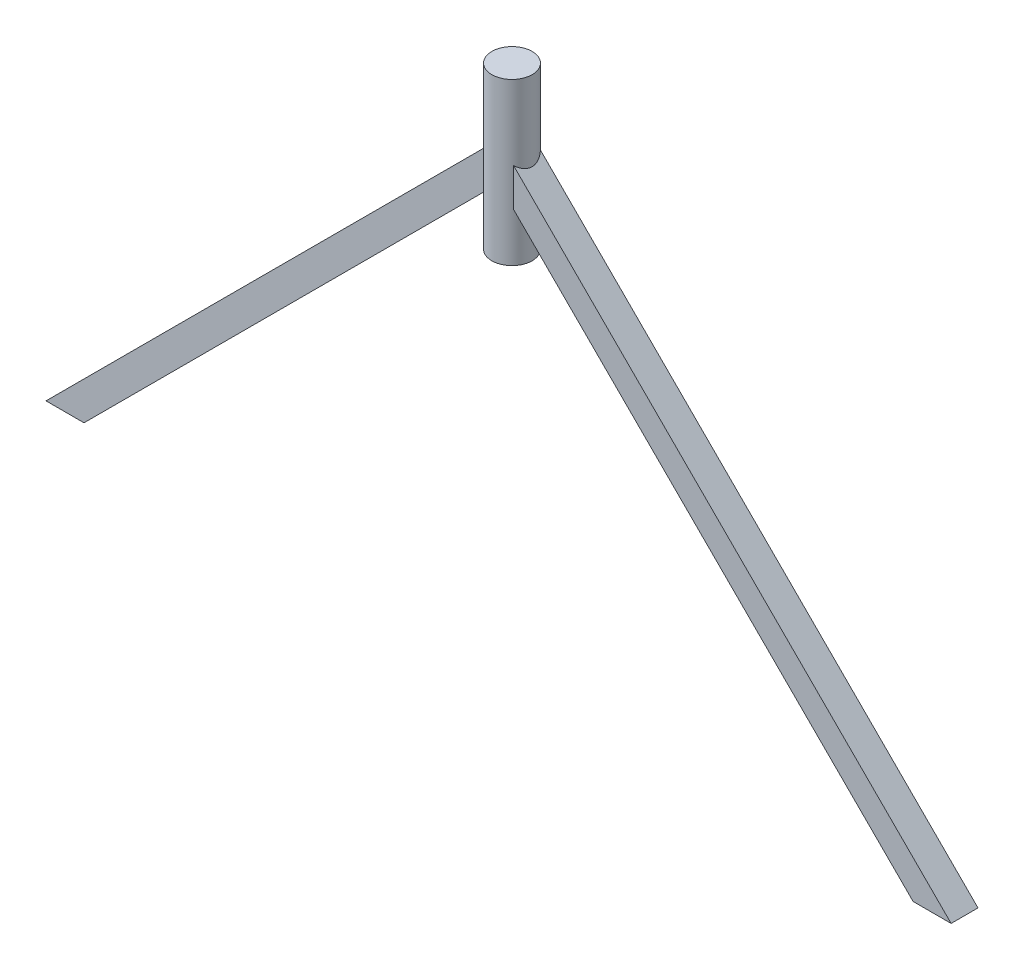
ISO-10303-21;
HEADER;
FILE_DESCRIPTION(('STEP AP214'),'2;1');
FILE_NAME('part.step','',(''),(''),'','','');
FILE_SCHEMA(('AUTOMOTIVE_DESIGN { 1 0 10303 214 1 1 1 1 }'));
ENDSEC;
DATA;
#1=APPLICATION_CONTEXT('core data for automotive mechanical design processes');
#2=APPLICATION_PROTOCOL_DEFINITION('international standard','automotive_design',2000,#1);
#3=PRODUCT_CONTEXT('',#1,'mechanical');
#4=PRODUCT('Part','Part','',(#3));
#5=PRODUCT_RELATED_PRODUCT_CATEGORY('part','',(#4));
#6=PRODUCT_DEFINITION_FORMATION('','',#4);
#7=PRODUCT_DEFINITION_CONTEXT('part definition',#1,'design');
#8=PRODUCT_DEFINITION('design','',#6,#7);
#9=PRODUCT_DEFINITION_SHAPE('','',#8);
#10=(LENGTH_UNIT() NAMED_UNIT(*) SI_UNIT(.MILLI.,.METRE.));
#11=(NAMED_UNIT(*) PLANE_ANGLE_UNIT() SI_UNIT($,.RADIAN.));
#12=(NAMED_UNIT(*) SI_UNIT($,.STERADIAN.) SOLID_ANGLE_UNIT());
#13=UNCERTAINTY_MEASURE_WITH_UNIT(LENGTH_MEASURE(1.E-05),#10,'distance_accuracy_value','');
#14=(GEOMETRIC_REPRESENTATION_CONTEXT(3) GLOBAL_UNCERTAINTY_ASSIGNED_CONTEXT((#13)) GLOBAL_UNIT_ASSIGNED_CONTEXT((#10,
#11,#12)) REPRESENTATION_CONTEXT('',''));
#15=CARTESIAN_POINT('',(0.,0.,0.));
#16=DIRECTION('',(0.,0.,1.));
#17=DIRECTION('',(1.,0.,0.));
#18=AXIS2_PLACEMENT_3D('',#15,#16,#17);
#19=CARTESIAN_POINT('',(0.,152.4,0.));
#20=DIRECTION('',(0.,-1.,0.));
#21=DIRECTION('',(0.,0.,-1.));
#22=AXIS2_PLACEMENT_3D('',#19,#20,#21);
#23=CYLINDRICAL_SURFACE('',#22,19.05);
#24=CARTESIAN_POINT('',(0.,60.1560899999988,0.));
#25=DIRECTION('',(0.707106781186547,0.707106781186548,0.));
#26=DIRECTION('',(0.707106781186548,-0.707106781186547,0.));
#27=AXIS2_PLACEMENT_3D('',#24,#25,#26);
#28=ELLIPSE('',#27,26.9407683632074,19.05);
#29=CARTESIAN_POINT('',(14.1990316571237,45.9570583428752,12.7));
#30=VERTEX_POINT('',#29);
#31=CARTESIAN_POINT('',(14.1990316571236,45.9570583428753,-12.7));
#32=VERTEX_POINT('',#31);
#33=EDGE_CURVE('E63',#30,#32,#28,.T.);
#34=ORIENTED_EDGE('',*,*,#33,.F.);
#35=DIRECTION('',(0.,-1.,0.));
#36=VECTOR('',#35,1.);
#37=CARTESIAN_POINT('',(14.1990316571237,152.4,12.7));
#38=LINE('',#37,#36);
#39=CARTESIAN_POINT('',(14.1990316571237,81.8780828271532,12.7));
#40=VERTEX_POINT('',#39);
#41=EDGE_CURVE('E11',#30,#40,#38,.F.);
#42=ORIENTED_EDGE('',*,*,#41,.T.);
#43=CARTESIAN_POINT('',(0.,96.0771144842769,0.));
#44=DIRECTION('',(-0.707106781186548,-0.707106781186548,0.));
#45=DIRECTION('',(0.707106781186548,-0.707106781186548,0.));
#46=AXIS2_PLACEMENT_3D('',#43,#44,#45);
#47=ELLIPSE('',#46,26.9407683632075,19.05);
#48=CARTESIAN_POINT('',(14.1990316571236,81.8780828271533,-12.7));
#49=VERTEX_POINT('',#48);
#50=EDGE_CURVE('E53',#49,#40,#47,.T.);
#51=ORIENTED_EDGE('',*,*,#50,.F.);
#52=DIRECTION('',(0.,-1.,0.));
#53=VECTOR('',#52,1.);
#54=CARTESIAN_POINT('',(14.1990316571237,152.4,-12.7));
#55=LINE('',#54,#53);
#56=EDGE_CURVE('E194',#32,#49,#55,.F.);
#57=ORIENTED_EDGE('',*,*,#56,.F.);
#58=EDGE_LOOP('',(#34,#42,#51,#57));
#59=FACE_BOUND('',#58,.T.);
#60=CARTESIAN_POINT('',(0.,96.0771144842769,0.));
#61=DIRECTION('',(-0.707106781186548,0.707106781186548,0.));
#62=DIRECTION('',(-0.707106781186548,-0.707106781186548,0.));
#63=AXIS2_PLACEMENT_3D('',#60,#61,#62);
#64=ELLIPSE('',#63,26.9407683632075,19.05);
#65=CARTESIAN_POINT('',(-14.1990316571236,81.8780828271533,-12.7));
#66=VERTEX_POINT('',#65);
#67=CARTESIAN_POINT('',(-14.1990316571237,81.8780828271532,12.7));
#68=VERTEX_POINT('',#67);
#69=EDGE_CURVE('E188',#66,#68,#64,.T.);
#70=ORIENTED_EDGE('',*,*,#69,.T.);
#71=DIRECTION('',(0.,-1.,0.));
#72=VECTOR('',#71,1.);
#73=CARTESIAN_POINT('',(-14.1990316571237,152.4,12.7));
#74=LINE('',#73,#72);
#75=CARTESIAN_POINT('',(-14.1990316571237,45.9570583428752,12.7));
#76=VERTEX_POINT('',#75);
#77=EDGE_CURVE('E191',#68,#76,#74,.T.);
#78=ORIENTED_EDGE('',*,*,#77,.T.);
#79=CARTESIAN_POINT('',(0.,60.1560899999988,0.));
#80=DIRECTION('',(0.707106781186547,-0.707106781186548,0.));
#81=DIRECTION('',(-0.707106781186548,-0.707106781186547,0.));
#82=AXIS2_PLACEMENT_3D('',#79,#80,#81);
#83=ELLIPSE('',#82,26.9407683632074,19.05);
#84=CARTESIAN_POINT('',(-14.1990316571236,45.9570583428753,-12.7));
#85=VERTEX_POINT('',#84);
#86=EDGE_CURVE('E185',#76,#85,#83,.T.);
#87=ORIENTED_EDGE('',*,*,#86,.T.);
#88=DIRECTION('',(0.,-1.,0.));
#89=VECTOR('',#88,1.);
#90=CARTESIAN_POINT('',(-14.1990316571237,152.4,-12.7));
#91=LINE('',#90,#89);
#92=EDGE_CURVE('E178',#66,#85,#91,.T.);
#93=ORIENTED_EDGE('',*,*,#92,.F.);
#94=EDGE_LOOP('',(#70,#78,#87,#93));
#95=FACE_BOUND('',#94,.T.);
#96=CARTESIAN_POINT('',(0.,152.4,0.));
#97=DIRECTION('',(0.,1.,0.));
#98=DIRECTION('',(0.,0.,1.));
#99=AXIS2_PLACEMENT_3D('',#96,#97,#98);
#100=CIRCLE('',#99,19.05);
#101=CARTESIAN_POINT('',(0.,152.4,19.05));
#102=VERTEX_POINT('',#101);
#103=EDGE_CURVE('E174',#102,#102,#100,.T.);
#104=ORIENTED_EDGE('',*,*,#103,.F.);
#105=EDGE_LOOP('',(#104));
#106=FACE_BOUND('',#105,.T.);
#107=CARTESIAN_POINT('',(0.,0.,0.));
#108=DIRECTION('',(0.,1.,0.));
#109=DIRECTION('',(0.,0.,1.));
#110=AXIS2_PLACEMENT_3D('',#107,#108,#109);
#111=CIRCLE('',#110,19.05);
#112=CARTESIAN_POINT('',(0.,0.,19.05));
#113=VERTEX_POINT('',#112);
#114=EDGE_CURVE('E173',#113,#113,#111,.T.);
#115=ORIENTED_EDGE('',*,*,#114,.T.);
#116=EDGE_LOOP('',(#115));
#117=FACE_BOUND('',#116,.T.);
#118=ADVANCED_FACE('F45',(#59,#95,#106,#117),#23,.T.);
#119=CARTESIAN_POINT('',(0.,152.4,0.));
#120=DIRECTION('',(0.,1.,0.));
#121=DIRECTION('',(0.,0.,1.));
#122=AXIS2_PLACEMENT_3D('',#119,#120,#121);
#123=PLANE('',#122);
#124=ORIENTED_EDGE('',*,*,#103,.T.);
#125=EDGE_LOOP('',(#124));
#126=FACE_BOUND('',#125,.T.);
#127=ADVANCED_FACE('F218',(#126),#123,.T.);
#128=CARTESIAN_POINT('',(0.,0.,0.));
#129=DIRECTION('',(0.,1.,0.));
#130=DIRECTION('',(0.,0.,1.));
#131=AXIS2_PLACEMENT_3D('',#128,#129,#130);
#132=PLANE('',#131);
#133=ORIENTED_EDGE('',*,*,#114,.F.);
#134=EDGE_LOOP('',(#133));
#135=FACE_BOUND('',#134,.T.);
#136=ADVANCED_FACE('F222',(#135),#132,.F.);
#137=CARTESIAN_POINT('',(0.,0.,12.7));
#138=DIRECTION('',(0.,0.,1.));
#139=DIRECTION('',(1.,0.,0.));
#140=AXIS2_PLACEMENT_3D('',#137,#138,#139);
#141=PLANE('',#140);
#142=ORIENTED_EDGE('',*,*,#77,.F.);
#143=DIRECTION('',(0.707106781186548,0.707106781186548,0.));
#144=VECTOR('',#143,1.);
#145=CARTESIAN_POINT('',(-48.0385572421384,48.0385572421384,12.7));
#146=LINE('',#145,#144);
#147=CARTESIAN_POINT('',(-427.750314484277,-331.6732,12.7));
#148=VERTEX_POINT('',#147);
#149=EDGE_CURVE('E145',#148,#68,#146,.T.);
#150=ORIENTED_EDGE('',*,*,#149,.F.);
#151=DIRECTION('',(-1.,0.,0.));
#152=VECTOR('',#151,1.);
#153=CARTESIAN_POINT('',(0.,-331.6732,12.7));
#154=LINE('',#153,#152);
#155=CARTESIAN_POINT('',(-391.82929,-331.6732,12.7));
#156=VERTEX_POINT('',#155);
#157=EDGE_CURVE('E149',#156,#148,#154,.T.);
#158=ORIENTED_EDGE('',*,*,#157,.F.);
#159=DIRECTION('',(-0.707106781186549,-0.707106781186547,0.));
#160=VECTOR('',#159,1.);
#161=CARTESIAN_POINT('',(-30.0780449999994,30.0780449999995,12.7));
#162=LINE('',#161,#160);
#163=EDGE_CURVE('E154',#76,#156,#162,.T.);
#164=ORIENTED_EDGE('',*,*,#163,.F.);
#165=EDGE_LOOP('',(#142,#150,#158,#164));
#166=FACE_BOUND('',#165,.T.);
#167=ADVANCED_FACE('F228',(#166),#141,.T.);
#168=CARTESIAN_POINT('',(0.,0.,-12.7));
#169=DIRECTION('',(0.,0.,1.));
#170=DIRECTION('',(1.,0.,0.));
#171=AXIS2_PLACEMENT_3D('',#168,#169,#170);
#172=PLANE('',#171);
#173=DIRECTION('',(0.707106781186548,0.707106781186548,0.));
#174=VECTOR('',#173,1.);
#175=CARTESIAN_POINT('',(-48.0385572421384,48.0385572421384,-12.7));
#176=LINE('',#175,#174);
#177=CARTESIAN_POINT('',(-427.750314484277,-331.6732,-12.7));
#178=VERTEX_POINT('',#177);
#179=EDGE_CURVE('E124',#178,#66,#176,.T.);
#180=ORIENTED_EDGE('',*,*,#179,.T.);
#181=ORIENTED_EDGE('',*,*,#92,.T.);
#182=DIRECTION('',(-0.707106781186549,-0.707106781186547,0.));
#183=VECTOR('',#182,1.);
#184=CARTESIAN_POINT('',(-30.0780449999994,30.0780449999995,-12.7));
#185=LINE('',#184,#183);
#186=CARTESIAN_POINT('',(-391.82929,-331.6732,-12.7));
#187=VERTEX_POINT('',#186);
#188=EDGE_CURVE('E150',#85,#187,#185,.T.);
#189=ORIENTED_EDGE('',*,*,#188,.T.);
#190=DIRECTION('',(-1.,0.,0.));
#191=VECTOR('',#190,1.);
#192=CARTESIAN_POINT('',(0.,-331.6732,-12.7));
#193=LINE('',#192,#191);
#194=EDGE_CURVE('E161',#187,#178,#193,.T.);
#195=ORIENTED_EDGE('',*,*,#194,.T.);
#196=EDGE_LOOP('',(#180,#181,#189,#195));
#197=FACE_BOUND('',#196,.T.);
#198=ADVANCED_FACE('F235',(#197),#172,.F.);
#199=CARTESIAN_POINT('',(-48.0385572421384,48.0385572421384,12.7));
#200=DIRECTION('',(-0.707106781186548,0.707106781186548,0.));
#201=DIRECTION('',(-0.707106781186548,-0.707106781186548,0.));
#202=AXIS2_PLACEMENT_3D('',#199,#200,#201);
#203=PLANE('',#202);
#204=ORIENTED_EDGE('',*,*,#69,.F.);
#205=ORIENTED_EDGE('',*,*,#179,.F.);
#206=DIRECTION('',(0.,0.,-1.));
#207=VECTOR('',#206,1.);
#208=CARTESIAN_POINT('',(-427.750314484277,-331.6732,12.7));
#209=LINE('',#208,#207);
#210=EDGE_CURVE('E170',#148,#178,#209,.T.);
#211=ORIENTED_EDGE('',*,*,#210,.F.);
#212=ORIENTED_EDGE('',*,*,#149,.T.);
#213=EDGE_LOOP('',(#204,#205,#211,#212));
#214=FACE_BOUND('',#213,.T.);
#215=ADVANCED_FACE('F231',(#214),#203,.T.);
#216=CARTESIAN_POINT('',(0.,-331.6732,12.7));
#217=DIRECTION('',(0.,-1.,0.));
#218=DIRECTION('',(0.,0.,-1.));
#219=AXIS2_PLACEMENT_3D('',#216,#217,#218);
#220=PLANE('',#219);
#221=ORIENTED_EDGE('',*,*,#194,.F.);
#222=DIRECTION('',(0.,0.,-1.));
#223=VECTOR('',#222,1.);
#224=CARTESIAN_POINT('',(-391.82929,-331.6732,12.7));
#225=LINE('',#224,#223);
#226=EDGE_CURVE('E157',#156,#187,#225,.T.);
#227=ORIENTED_EDGE('',*,*,#226,.F.);
#228=ORIENTED_EDGE('',*,*,#157,.T.);
#229=ORIENTED_EDGE('',*,*,#210,.T.);
#230=EDGE_LOOP('',(#221,#227,#228,#229));
#231=FACE_BOUND('',#230,.T.);
#232=ADVANCED_FACE('F234',(#231),#220,.T.);
#233=CARTESIAN_POINT('',(-30.0780449999994,30.0780449999995,12.7));
#234=DIRECTION('',(0.707106781186547,-0.707106781186548,0.));
#235=DIRECTION('',(0.707106781186548,0.707106781186547,0.));
#236=AXIS2_PLACEMENT_3D('',#233,#234,#235);
#237=PLANE('',#236);
#238=ORIENTED_EDGE('',*,*,#86,.F.);
#239=ORIENTED_EDGE('',*,*,#163,.T.);
#240=ORIENTED_EDGE('',*,*,#226,.T.);
#241=ORIENTED_EDGE('',*,*,#188,.F.);
#242=EDGE_LOOP('',(#238,#239,#240,#241));
#243=FACE_BOUND('',#242,.T.);
#244=ADVANCED_FACE('F214',(#243),#237,.T.);
#245=CARTESIAN_POINT('',(0.,0.,12.7));
#246=DIRECTION('',(0.,0.,1.));
#247=DIRECTION('',(-1.,0.,0.));
#248=AXIS2_PLACEMENT_3D('',#245,#246,#247);
#249=PLANE('',#248);
#250=ORIENTED_EDGE('',*,*,#41,.F.);
#251=DIRECTION('',(0.707106781186549,-0.707106781186547,0.));
#252=VECTOR('',#251,1.);
#253=CARTESIAN_POINT('',(30.0780449999994,30.0780449999995,12.7));
#254=LINE('',#253,#252);
#255=CARTESIAN_POINT('',(391.82929,-331.6732,12.7));
#256=VERTEX_POINT('',#255);
#257=EDGE_CURVE('E105',#30,#256,#254,.T.);
#258=ORIENTED_EDGE('',*,*,#257,.T.);
#259=DIRECTION('',(1.,0.,0.));
#260=VECTOR('',#259,1.);
#261=CARTESIAN_POINT('',(0.,-331.6732,12.7));
#262=LINE('',#261,#260);
#263=CARTESIAN_POINT('',(427.750314484277,-331.6732,12.7));
#264=VERTEX_POINT('',#263);
#265=EDGE_CURVE('E110',#256,#264,#262,.T.);
#266=ORIENTED_EDGE('',*,*,#265,.T.);
#267=DIRECTION('',(-0.707106781186548,0.707106781186548,0.));
#268=VECTOR('',#267,1.);
#269=CARTESIAN_POINT('',(48.0385572421384,48.0385572421384,12.7));
#270=LINE('',#269,#268);
#271=EDGE_CURVE('E114',#264,#40,#270,.T.);
#272=ORIENTED_EDGE('',*,*,#271,.T.);
#273=EDGE_LOOP('',(#250,#258,#266,#272));
#274=FACE_BOUND('',#273,.T.);
#275=ADVANCED_FACE('F107',(#274),#249,.T.);
#276=CARTESIAN_POINT('',(0.,0.,-12.7));
#277=DIRECTION('',(0.,0.,1.));
#278=DIRECTION('',(-1.,0.,0.));
#279=AXIS2_PLACEMENT_3D('',#276,#277,#278);
#280=PLANE('',#279);
#281=DIRECTION('',(0.707106781186549,-0.707106781186547,0.));
#282=VECTOR('',#281,1.);
#283=CARTESIAN_POINT('',(30.0780449999994,30.0780449999995,-12.7));
#284=LINE('',#283,#282);
#285=CARTESIAN_POINT('',(391.82929,-331.6732,-12.7));
#286=VERTEX_POINT('',#285);
#287=EDGE_CURVE('E120',#32,#286,#284,.T.);
#288=ORIENTED_EDGE('',*,*,#287,.F.);
#289=ORIENTED_EDGE('',*,*,#56,.T.);
#290=DIRECTION('',(-0.707106781186548,0.707106781186548,0.));
#291=VECTOR('',#290,1.);
#292=CARTESIAN_POINT('',(48.0385572421384,48.0385572421384,-12.7));
#293=LINE('',#292,#291);
#294=CARTESIAN_POINT('',(427.750314484277,-331.6732,-12.7));
#295=VERTEX_POINT('',#294);
#296=EDGE_CURVE('E136',#295,#49,#293,.T.);
#297=ORIENTED_EDGE('',*,*,#296,.F.);
#298=DIRECTION('',(1.,0.,0.));
#299=VECTOR('',#298,1.);
#300=CARTESIAN_POINT('',(0.,-331.6732,-12.7));
#301=LINE('',#300,#299);
#302=EDGE_CURVE('E142',#286,#295,#301,.T.);
#303=ORIENTED_EDGE('',*,*,#302,.F.);
#304=EDGE_LOOP('',(#288,#289,#297,#303));
#305=FACE_BOUND('',#304,.T.);
#306=ADVANCED_FACE('F206',(#305),#280,.F.);
#307=CARTESIAN_POINT('',(48.0385572421384,48.0385572421384,12.7));
#308=DIRECTION('',(-0.707106781186548,-0.707106781186548,0.));
#309=DIRECTION('',(0.707106781186548,-0.707106781186548,0.));
#310=AXIS2_PLACEMENT_3D('',#307,#308,#309);
#311=PLANE('',#310);
#312=ORIENTED_EDGE('',*,*,#296,.T.);
#313=ORIENTED_EDGE('',*,*,#50,.T.);
#314=ORIENTED_EDGE('',*,*,#271,.F.);
#315=DIRECTION('',(0.,0.,-1.));
#316=VECTOR('',#315,1.);
#317=CARTESIAN_POINT('',(427.750314484277,-331.6732,12.7));
#318=LINE('',#317,#316);
#319=EDGE_CURVE('E125',#264,#295,#318,.T.);
#320=ORIENTED_EDGE('',*,*,#319,.T.);
#321=EDGE_LOOP('',(#312,#313,#314,#320));
#322=FACE_BOUND('',#321,.T.);
#323=ADVANCED_FACE('F201',(#322),#311,.F.);
#324=CARTESIAN_POINT('',(30.0780449999994,30.0780449999995,12.7));
#325=DIRECTION('',(0.707106781186547,0.707106781186548,0.));
#326=DIRECTION('',(-0.707106781186548,0.707106781186547,0.));
#327=AXIS2_PLACEMENT_3D('',#324,#325,#326);
#328=PLANE('',#327);
#329=ORIENTED_EDGE('',*,*,#257,.F.);
#330=ORIENTED_EDGE('',*,*,#33,.T.);
#331=ORIENTED_EDGE('',*,*,#287,.T.);
#332=DIRECTION('',(0.,0.,-1.));
#333=VECTOR('',#332,1.);
#334=CARTESIAN_POINT('',(391.82929,-331.6732,12.7));
#335=LINE('',#334,#333);
#336=EDGE_CURVE('E117',#256,#286,#335,.T.);
#337=ORIENTED_EDGE('',*,*,#336,.F.);
#338=EDGE_LOOP('',(#329,#330,#331,#337));
#339=FACE_BOUND('',#338,.T.);
#340=ADVANCED_FACE('F118',(#339),#328,.F.);
#341=CARTESIAN_POINT('',(0.,-331.6732,12.7));
#342=DIRECTION('',(0.,1.,0.));
#343=DIRECTION('',(0.,0.,1.));
#344=AXIS2_PLACEMENT_3D('',#341,#342,#343);
#345=PLANE('',#344);
#346=ORIENTED_EDGE('',*,*,#302,.T.);
#347=ORIENTED_EDGE('',*,*,#319,.F.);
#348=ORIENTED_EDGE('',*,*,#265,.F.);
#349=ORIENTED_EDGE('',*,*,#336,.T.);
#350=EDGE_LOOP('',(#346,#347,#348,#349));
#351=FACE_BOUND('',#350,.T.);
#352=ADVANCED_FACE('F127',(#351),#345,.F.);
#353=CLOSED_SHELL('',(#118,#127,#136,#167,#198,#215,#232,#244,#275,#306,#323,#340,#352));
#354=MANIFOLD_SOLID_BREP('B2',#353);
#355=ADVANCED_BREP_SHAPE_REPRESENTATION('',(#18,#354),#14);
#356=SHAPE_DEFINITION_REPRESENTATION(#9,#355);
ENDSEC;
END-ISO-10303-21;
